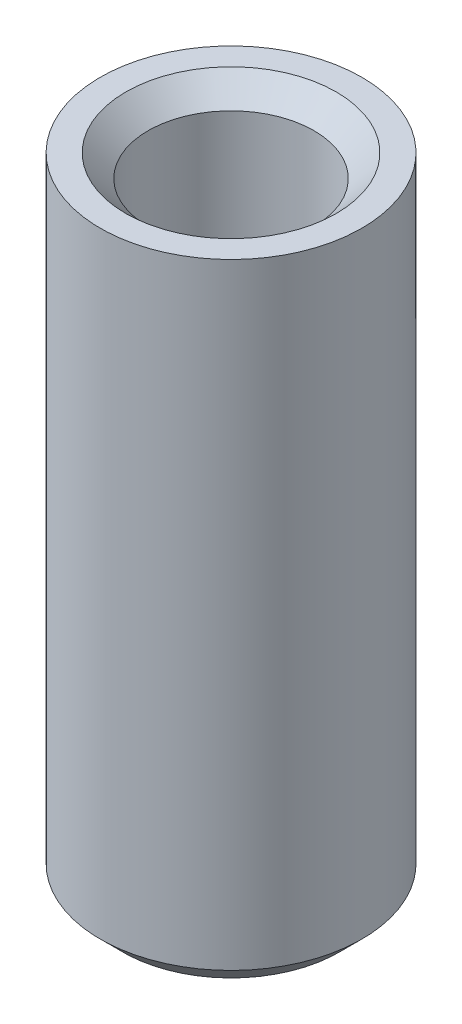
ISO-10303-21;
HEADER;
FILE_DESCRIPTION(('STEP AP214'),'2;1');
FILE_NAME('part.step','',(''),(''),'','','');
FILE_SCHEMA(('AUTOMOTIVE_DESIGN { 1 0 10303 214 1 1 1 1 }'));
ENDSEC;
DATA;
#1=APPLICATION_CONTEXT('core data for automotive mechanical design processes');
#2=APPLICATION_PROTOCOL_DEFINITION('international standard','automotive_design',2000,#1);
#3=PRODUCT_CONTEXT('',#1,'mechanical');
#4=PRODUCT('Part','Part','',(#3));
#5=PRODUCT_RELATED_PRODUCT_CATEGORY('part','',(#4));
#6=PRODUCT_DEFINITION_FORMATION('','',#4);
#7=PRODUCT_DEFINITION_CONTEXT('part definition',#1,'design');
#8=PRODUCT_DEFINITION('design','',#6,#7);
#9=PRODUCT_DEFINITION_SHAPE('','',#8);
#10=(LENGTH_UNIT() NAMED_UNIT(*) SI_UNIT(.MILLI.,.METRE.));
#11=(NAMED_UNIT(*) PLANE_ANGLE_UNIT() SI_UNIT($,.RADIAN.));
#12=(NAMED_UNIT(*) SI_UNIT($,.STERADIAN.) SOLID_ANGLE_UNIT());
#13=UNCERTAINTY_MEASURE_WITH_UNIT(LENGTH_MEASURE(1.E-05),#10,'distance_accuracy_value','');
#14=(GEOMETRIC_REPRESENTATION_CONTEXT(3) GLOBAL_UNCERTAINTY_ASSIGNED_CONTEXT((#13)) GLOBAL_UNIT_ASSIGNED_CONTEXT((#10,
#11,#12)) REPRESENTATION_CONTEXT('',''));
#15=CARTESIAN_POINT('',(0.,0.,0.));
#16=DIRECTION('',(0.,0.,1.));
#17=DIRECTION('',(1.,0.,0.));
#18=AXIS2_PLACEMENT_3D('',#15,#16,#17);
#19=CARTESIAN_POINT('',(0.,0.,0.));
#20=DIRECTION('',(0.,-1.,0.));
#21=DIRECTION('',(0.,0.,-1.));
#22=AXIS2_PLACEMENT_3D('',#19,#20,#21);
#23=CYLINDRICAL_SURFACE('',#22,2.6);
#24=CARTESIAN_POINT('',(0.,19.3,0.));
#25=DIRECTION('',(0.,-1.,0.));
#26=DIRECTION('',(0.,0.,-1.));
#27=AXIS2_PLACEMENT_3D('',#24,#25,#26);
#28=CIRCLE('',#27,2.6);
#29=CARTESIAN_POINT('',(0.,19.3,-2.6));
#30=VERTEX_POINT('',#29);
#31=EDGE_CURVE('E52',#30,#30,#28,.T.);
#32=ORIENTED_EDGE('',*,*,#31,.F.);
#33=EDGE_LOOP('',(#32));
#34=FACE_BOUND('',#33,.T.);
#35=CARTESIAN_POINT('',(0.,0.,0.));
#36=DIRECTION('',(0.,-1.,0.));
#37=DIRECTION('',(0.,0.,-1.));
#38=AXIS2_PLACEMENT_3D('',#35,#36,#37);
#39=CIRCLE('',#38,2.6);
#40=CARTESIAN_POINT('',(0.,0.,-2.6));
#41=VERTEX_POINT('',#40);
#42=EDGE_CURVE('E10',#41,#41,#39,.T.);
#43=ORIENTED_EDGE('',*,*,#42,.T.);
#44=EDGE_LOOP('',(#43));
#45=FACE_BOUND('',#44,.T.);
#46=ADVANCED_FACE('F30',(#34,#45),#23,.F.);
#47=CARTESIAN_POINT('',(-2.6,0.,0.));
#48=DIRECTION('',(0.,1.,0.));
#49=DIRECTION('',(0.,0.,1.));
#50=AXIS2_PLACEMENT_3D('',#47,#48,#49);
#51=PLANE('',#50);
#52=ORIENTED_EDGE('',*,*,#42,.F.);
#53=EDGE_LOOP('',(#52));
#54=FACE_BOUND('',#53,.T.);
#55=CARTESIAN_POINT('',(0.,0.,0.));
#56=DIRECTION('',(0.,-1.,0.));
#57=DIRECTION('',(0.,0.,-1.));
#58=AXIS2_PLACEMENT_3D('',#55,#56,#57);
#59=CIRCLE('',#58,3.4);
#60=CARTESIAN_POINT('',(0.,0.,-3.4));
#61=VERTEX_POINT('',#60);
#62=EDGE_CURVE('E36',#61,#61,#59,.T.);
#63=ORIENTED_EDGE('',*,*,#62,.T.);
#64=EDGE_LOOP('',(#63));
#65=FACE_BOUND('',#64,.T.);
#66=ADVANCED_FACE('F59',(#54,#65),#51,.F.);
#67=CARTESIAN_POINT('',(0.,0.699999999999981,0.));
#68=DIRECTION('',(0.,1.,0.));
#69=DIRECTION('',(0.,0.,1.));
#70=AXIS2_PLACEMENT_3D('',#67,#68,#69);
#71=CONICAL_SURFACE('',#70,4.1,0.785398163397461);
#72=ORIENTED_EDGE('',*,*,#62,.F.);
#73=EDGE_LOOP('',(#72));
#74=FACE_BOUND('',#73,.T.);
#75=CARTESIAN_POINT('',(0.,0.699999999999981,0.));
#76=DIRECTION('',(0.,-1.,0.));
#77=DIRECTION('',(0.,0.,-1.));
#78=AXIS2_PLACEMENT_3D('',#75,#76,#77);
#79=CIRCLE('',#78,4.1);
#80=CARTESIAN_POINT('',(0.,0.699999999999981,-4.1));
#81=VERTEX_POINT('',#80);
#82=EDGE_CURVE('E40',#81,#81,#79,.T.);
#83=ORIENTED_EDGE('',*,*,#82,.T.);
#84=EDGE_LOOP('',(#83));
#85=FACE_BOUND('',#84,.T.);
#86=ADVANCED_FACE('F63',(#74,#85),#71,.T.);
#87=CARTESIAN_POINT('',(0.,0.,0.));
#88=DIRECTION('',(0.,-1.,0.));
#89=DIRECTION('',(0.,0.,-1.));
#90=AXIS2_PLACEMENT_3D('',#87,#88,#89);
#91=CYLINDRICAL_SURFACE('',#90,4.1);
#92=ORIENTED_EDGE('',*,*,#82,.F.);
#93=EDGE_LOOP('',(#92));
#94=FACE_BOUND('',#93,.T.);
#95=CARTESIAN_POINT('',(0.,20.,0.));
#96=DIRECTION('',(0.,-1.,0.));
#97=DIRECTION('',(0.,0.,-1.));
#98=AXIS2_PLACEMENT_3D('',#95,#96,#97);
#99=CIRCLE('',#98,4.1);
#100=CARTESIAN_POINT('',(0.,20.,-4.1));
#101=VERTEX_POINT('',#100);
#102=EDGE_CURVE('E44',#101,#101,#99,.T.);
#103=ORIENTED_EDGE('',*,*,#102,.T.);
#104=EDGE_LOOP('',(#103));
#105=FACE_BOUND('',#104,.T.);
#106=ADVANCED_FACE('F68',(#94,#105),#91,.T.);
#107=CARTESIAN_POINT('',(-4.1,20.,0.));
#108=DIRECTION('',(0.,-1.,0.));
#109=DIRECTION('',(0.,0.,-1.));
#110=AXIS2_PLACEMENT_3D('',#107,#108,#109);
#111=PLANE('',#110);
#112=ORIENTED_EDGE('',*,*,#102,.F.);
#113=EDGE_LOOP('',(#112));
#114=FACE_BOUND('',#113,.T.);
#115=CARTESIAN_POINT('',(0.,20.,0.));
#116=DIRECTION('',(0.,-1.,0.));
#117=DIRECTION('',(0.,0.,-1.));
#118=AXIS2_PLACEMENT_3D('',#115,#116,#117);
#119=CIRCLE('',#118,3.3);
#120=CARTESIAN_POINT('',(0.,20.,-3.3));
#121=VERTEX_POINT('',#120);
#122=EDGE_CURVE('E49',#121,#121,#119,.T.);
#123=ORIENTED_EDGE('',*,*,#122,.T.);
#124=EDGE_LOOP('',(#123));
#125=FACE_BOUND('',#124,.T.);
#126=ADVANCED_FACE('F74',(#114,#125),#111,.F.);
#127=CARTESIAN_POINT('',(0.,19.3,0.));
#128=DIRECTION('',(0.,1.,0.));
#129=DIRECTION('',(0.,0.,1.));
#130=AXIS2_PLACEMENT_3D('',#127,#128,#129);
#131=CONICAL_SURFACE('',#130,2.6,0.785398163397461);
#132=ORIENTED_EDGE('',*,*,#122,.F.);
#133=EDGE_LOOP('',(#132));
#134=FACE_BOUND('',#133,.T.);
#135=ORIENTED_EDGE('',*,*,#31,.T.);
#136=EDGE_LOOP('',(#135));
#137=FACE_BOUND('',#136,.T.);
#138=ADVANCED_FACE('F56',(#134,#137),#131,.F.);
#139=CLOSED_SHELL('',(#46,#66,#86,#106,#126,#138));
#140=MANIFOLD_SOLID_BREP('B2',#139);
#141=ADVANCED_BREP_SHAPE_REPRESENTATION('',(#18,#140),#14);
#142=SHAPE_DEFINITION_REPRESENTATION(#9,#141);
ENDSEC;
END-ISO-10303-21;
